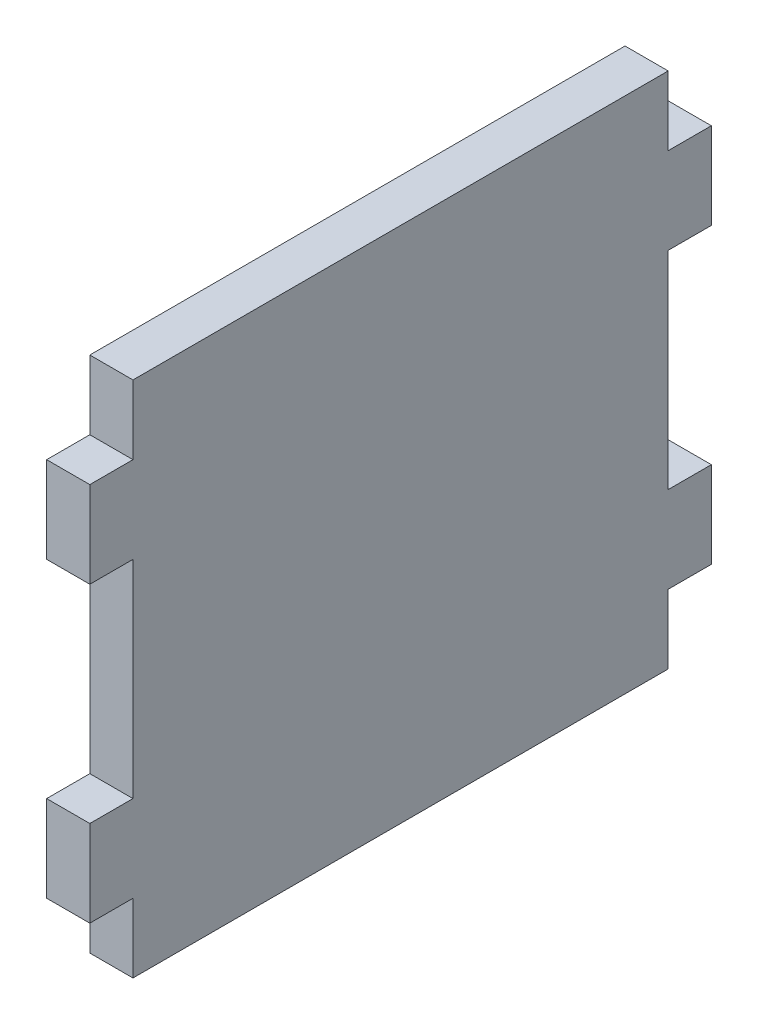
ISO-10303-21;
HEADER;
FILE_DESCRIPTION(('STEP AP214'),'2;1');
FILE_NAME('part.step','',(''),(''),'','','');
FILE_SCHEMA(('AUTOMOTIVE_DESIGN { 1 0 10303 214 1 1 1 1 }'));
ENDSEC;
DATA;
#1=APPLICATION_CONTEXT('core data for automotive mechanical design processes');
#2=APPLICATION_PROTOCOL_DEFINITION('international standard','automotive_design',2000,#1);
#3=PRODUCT_CONTEXT('',#1,'mechanical');
#4=PRODUCT('Part','Part','',(#3));
#5=PRODUCT_RELATED_PRODUCT_CATEGORY('part','',(#4));
#6=PRODUCT_DEFINITION_FORMATION('','',#4);
#7=PRODUCT_DEFINITION_CONTEXT('part definition',#1,'design');
#8=PRODUCT_DEFINITION('design','',#6,#7);
#9=PRODUCT_DEFINITION_SHAPE('','',#8);
#10=(LENGTH_UNIT() NAMED_UNIT(*) SI_UNIT(.MILLI.,.METRE.));
#11=(NAMED_UNIT(*) PLANE_ANGLE_UNIT() SI_UNIT($,.RADIAN.));
#12=(NAMED_UNIT(*) SI_UNIT($,.STERADIAN.) SOLID_ANGLE_UNIT());
#13=UNCERTAINTY_MEASURE_WITH_UNIT(LENGTH_MEASURE(1.E-05),#10,'distance_accuracy_value','');
#14=(GEOMETRIC_REPRESENTATION_CONTEXT(3) GLOBAL_UNCERTAINTY_ASSIGNED_CONTEXT((#13)) GLOBAL_UNIT_ASSIGNED_CONTEXT((#10,
#11,#12)) REPRESENTATION_CONTEXT('',''));
#15=CARTESIAN_POINT('',(0.,0.,0.));
#16=DIRECTION('',(0.,0.,1.));
#17=DIRECTION('',(1.,0.,0.));
#18=AXIS2_PLACEMENT_3D('',#15,#16,#17);
#19=CARTESIAN_POINT('',(5.,22.,28.));
#20=DIRECTION('',(0.,0.,-1.));
#21=DIRECTION('',(0.,1.,0.));
#22=AXIS2_PLACEMENT_3D('',#19,#20,#21);
#23=PLANE('',#22);
#24=DIRECTION('',(0.,-1.,0.));
#25=VECTOR('',#24,1.);
#26=CARTESIAN_POINT('',(0.,22.,28.));
#27=LINE('',#26,#25);
#28=CARTESIAN_POINT('',(0.,30.,28.));
#29=VERTEX_POINT('',#28);
#30=CARTESIAN_POINT('',(0.,22.,28.));
#31=VERTEX_POINT('',#30);
#32=EDGE_CURVE('E208',#29,#31,#27,.T.);
#33=ORIENTED_EDGE('',*,*,#32,.T.);
#34=DIRECTION('',(-1.,0.,0.));
#35=VECTOR('',#34,1.);
#36=CARTESIAN_POINT('',(5.,22.,28.));
#37=LINE('',#36,#35);
#38=CARTESIAN_POINT('',(5.,22.,28.));
#39=VERTEX_POINT('',#38);
#40=EDGE_CURVE('E11',#39,#31,#37,.T.);
#41=ORIENTED_EDGE('',*,*,#40,.F.);
#42=DIRECTION('',(0.,-1.,0.));
#43=VECTOR('',#42,1.);
#44=CARTESIAN_POINT('',(5.,22.,28.));
#45=LINE('',#44,#43);
#46=CARTESIAN_POINT('',(5.,30.,28.));
#47=VERTEX_POINT('',#46);
#48=EDGE_CURVE('E248',#47,#39,#45,.T.);
#49=ORIENTED_EDGE('',*,*,#48,.F.);
#50=DIRECTION('',(-1.,0.,0.));
#51=VECTOR('',#50,1.);
#52=CARTESIAN_POINT('',(5.,30.,28.));
#53=LINE('',#52,#51);
#54=EDGE_CURVE('E204',#47,#29,#53,.T.);
#55=ORIENTED_EDGE('',*,*,#54,.T.);
#56=EDGE_LOOP('',(#33,#41,#49,#55));
#57=FACE_BOUND('',#56,.T.);
#58=ADVANCED_FACE('F39',(#57),#23,.F.);
#59=CARTESIAN_POINT('',(5.,22.,33.));
#60=DIRECTION('',(0.,-1.,0.));
#61=DIRECTION('',(0.,0.,-1.));
#62=AXIS2_PLACEMENT_3D('',#59,#60,#61);
#63=PLANE('',#62);
#64=DIRECTION('',(0.,0.,1.));
#65=VECTOR('',#64,1.);
#66=CARTESIAN_POINT('',(0.,22.,33.));
#67=LINE('',#66,#65);
#68=CARTESIAN_POINT('',(0.,22.,33.));
#69=VERTEX_POINT('',#68);
#70=EDGE_CURVE('E211',#31,#69,#67,.T.);
#71=ORIENTED_EDGE('',*,*,#70,.T.);
#72=DIRECTION('',(-1.,0.,0.));
#73=VECTOR('',#72,1.);
#74=CARTESIAN_POINT('',(5.,22.,33.));
#75=LINE('',#74,#73);
#76=CARTESIAN_POINT('',(5.,22.,33.));
#77=VERTEX_POINT('',#76);
#78=EDGE_CURVE('E47',#77,#69,#75,.T.);
#79=ORIENTED_EDGE('',*,*,#78,.F.);
#80=DIRECTION('',(0.,0.,1.));
#81=VECTOR('',#80,1.);
#82=CARTESIAN_POINT('',(5.,22.,33.));
#83=LINE('',#82,#81);
#84=EDGE_CURVE('E132',#39,#77,#83,.T.);
#85=ORIENTED_EDGE('',*,*,#84,.F.);
#86=ORIENTED_EDGE('',*,*,#40,.T.);
#87=EDGE_LOOP('',(#71,#79,#85,#86));
#88=FACE_BOUND('',#87,.T.);
#89=ADVANCED_FACE('F356',(#88),#63,.F.);
#90=CARTESIAN_POINT('',(5.,12.,33.));
#91=DIRECTION('',(0.,0.,-1.));
#92=DIRECTION('',(-1.,0.,0.));
#93=AXIS2_PLACEMENT_3D('',#90,#91,#92);
#94=PLANE('',#93);
#95=DIRECTION('',(0.,-1.,0.));
#96=VECTOR('',#95,1.);
#97=CARTESIAN_POINT('',(0.,12.,33.));
#98=LINE('',#97,#96);
#99=CARTESIAN_POINT('',(0.,12.,33.));
#100=VERTEX_POINT('',#99);
#101=EDGE_CURVE('E213',#69,#100,#98,.T.);
#102=ORIENTED_EDGE('',*,*,#101,.T.);
#103=DIRECTION('',(-1.,0.,0.));
#104=VECTOR('',#103,1.);
#105=CARTESIAN_POINT('',(5.,12.,33.));
#106=LINE('',#105,#104);
#107=CARTESIAN_POINT('',(5.,12.,33.));
#108=VERTEX_POINT('',#107);
#109=EDGE_CURVE('E291',#108,#100,#106,.T.);
#110=ORIENTED_EDGE('',*,*,#109,.F.);
#111=DIRECTION('',(0.,-1.,0.));
#112=VECTOR('',#111,1.);
#113=CARTESIAN_POINT('',(5.,12.,33.));
#114=LINE('',#113,#112);
#115=EDGE_CURVE('E299',#77,#108,#114,.T.);
#116=ORIENTED_EDGE('',*,*,#115,.F.);
#117=ORIENTED_EDGE('',*,*,#78,.T.);
#118=EDGE_LOOP('',(#102,#110,#116,#117));
#119=FACE_BOUND('',#118,.T.);
#120=ADVANCED_FACE('F297',(#119),#94,.F.);
#121=CARTESIAN_POINT('',(5.,12.,28.));
#122=DIRECTION('',(0.,1.,0.));
#123=DIRECTION('',(0.,0.,1.));
#124=AXIS2_PLACEMENT_3D('',#121,#122,#123);
#125=PLANE('',#124);
#126=DIRECTION('',(0.,0.,-1.));
#127=VECTOR('',#126,1.);
#128=CARTESIAN_POINT('',(0.,12.,28.));
#129=LINE('',#128,#127);
#130=CARTESIAN_POINT('',(0.,12.,28.));
#131=VERTEX_POINT('',#130);
#132=EDGE_CURVE('E215',#100,#131,#129,.T.);
#133=ORIENTED_EDGE('',*,*,#132,.T.);
#134=DIRECTION('',(-1.,0.,0.));
#135=VECTOR('',#134,1.);
#136=CARTESIAN_POINT('',(5.,12.,28.));
#137=LINE('',#136,#135);
#138=CARTESIAN_POINT('',(5.,12.,28.));
#139=VERTEX_POINT('',#138);
#140=EDGE_CURVE('E288',#139,#131,#137,.T.);
#141=ORIENTED_EDGE('',*,*,#140,.F.);
#142=DIRECTION('',(0.,0.,-1.));
#143=VECTOR('',#142,1.);
#144=CARTESIAN_POINT('',(5.,12.,28.));
#145=LINE('',#144,#143);
#146=EDGE_CURVE('E315',#108,#139,#145,.T.);
#147=ORIENTED_EDGE('',*,*,#146,.F.);
#148=ORIENTED_EDGE('',*,*,#109,.T.);
#149=EDGE_LOOP('',(#133,#141,#147,#148));
#150=FACE_BOUND('',#149,.T.);
#151=ADVANCED_FACE('F306',(#150),#125,.F.);
#152=CARTESIAN_POINT('',(5.,-12.,28.));
#153=DIRECTION('',(0.,0.,-1.));
#154=DIRECTION('',(0.,1.,0.));
#155=AXIS2_PLACEMENT_3D('',#152,#153,#154);
#156=PLANE('',#155);
#157=DIRECTION('',(0.,-1.,0.));
#158=VECTOR('',#157,1.);
#159=CARTESIAN_POINT('',(0.,-12.,28.));
#160=LINE('',#159,#158);
#161=CARTESIAN_POINT('',(0.,-12.,28.));
#162=VERTEX_POINT('',#161);
#163=EDGE_CURVE('E217',#131,#162,#160,.T.);
#164=ORIENTED_EDGE('',*,*,#163,.T.);
#165=DIRECTION('',(-1.,0.,0.));
#166=VECTOR('',#165,1.);
#167=CARTESIAN_POINT('',(5.,-12.,28.));
#168=LINE('',#167,#166);
#169=CARTESIAN_POINT('',(5.,-12.,28.));
#170=VERTEX_POINT('',#169);
#171=EDGE_CURVE('E285',#170,#162,#168,.T.);
#172=ORIENTED_EDGE('',*,*,#171,.F.);
#173=DIRECTION('',(0.,-1.,0.));
#174=VECTOR('',#173,1.);
#175=CARTESIAN_POINT('',(5.,-12.,28.));
#176=LINE('',#175,#174);
#177=EDGE_CURVE('E312',#139,#170,#176,.T.);
#178=ORIENTED_EDGE('',*,*,#177,.F.);
#179=ORIENTED_EDGE('',*,*,#140,.T.);
#180=EDGE_LOOP('',(#164,#172,#178,#179));
#181=FACE_BOUND('',#180,.T.);
#182=ADVANCED_FACE('F310',(#181),#156,.F.);
#183=CARTESIAN_POINT('',(5.,-12.,28.));
#184=DIRECTION('',(0.,-1.,0.));
#185=DIRECTION('',(0.,0.,-1.));
#186=AXIS2_PLACEMENT_3D('',#183,#184,#185);
#187=PLANE('',#186);
#188=DIRECTION('',(0.,0.,1.));
#189=VECTOR('',#188,1.);
#190=CARTESIAN_POINT('',(0.,-12.,28.));
#191=LINE('',#190,#189);
#192=CARTESIAN_POINT('',(0.,-12.,33.));
#193=VERTEX_POINT('',#192);
#194=EDGE_CURVE('E219',#162,#193,#191,.T.);
#195=ORIENTED_EDGE('',*,*,#194,.T.);
#196=DIRECTION('',(-1.,0.,0.));
#197=VECTOR('',#196,1.);
#198=CARTESIAN_POINT('',(5.,-12.,33.));
#199=LINE('',#198,#197);
#200=CARTESIAN_POINT('',(5.,-12.,33.));
#201=VERTEX_POINT('',#200);
#202=EDGE_CURVE('E282',#201,#193,#199,.T.);
#203=ORIENTED_EDGE('',*,*,#202,.F.);
#204=DIRECTION('',(0.,0.,1.));
#205=VECTOR('',#204,1.);
#206=CARTESIAN_POINT('',(5.,-12.,28.));
#207=LINE('',#206,#205);
#208=EDGE_CURVE('E314',#170,#201,#207,.T.);
#209=ORIENTED_EDGE('',*,*,#208,.F.);
#210=ORIENTED_EDGE('',*,*,#171,.T.);
#211=EDGE_LOOP('',(#195,#203,#209,#210));
#212=FACE_BOUND('',#211,.T.);
#213=ADVANCED_FACE('F368',(#212),#187,.F.);
#214=CARTESIAN_POINT('',(5.,-12.,33.));
#215=DIRECTION('',(0.,0.,-1.));
#216=DIRECTION('',(-1.,0.,0.));
#217=AXIS2_PLACEMENT_3D('',#214,#215,#216);
#218=PLANE('',#217);
#219=DIRECTION('',(0.,-1.,0.));
#220=VECTOR('',#219,1.);
#221=CARTESIAN_POINT('',(0.,-12.,33.));
#222=LINE('',#221,#220);
#223=CARTESIAN_POINT('',(0.,-22.,33.));
#224=VERTEX_POINT('',#223);
#225=EDGE_CURVE('E221',#193,#224,#222,.T.);
#226=ORIENTED_EDGE('',*,*,#225,.T.);
#227=DIRECTION('',(-1.,0.,0.));
#228=VECTOR('',#227,1.);
#229=CARTESIAN_POINT('',(5.,-22.,33.));
#230=LINE('',#229,#228);
#231=CARTESIAN_POINT('',(5.,-22.,33.));
#232=VERTEX_POINT('',#231);
#233=EDGE_CURVE('E279',#232,#224,#230,.T.);
#234=ORIENTED_EDGE('',*,*,#233,.F.);
#235=DIRECTION('',(0.,-1.,0.));
#236=VECTOR('',#235,1.);
#237=CARTESIAN_POINT('',(5.,-12.,33.));
#238=LINE('',#237,#236);
#239=EDGE_CURVE('E317',#201,#232,#238,.T.);
#240=ORIENTED_EDGE('',*,*,#239,.F.);
#241=ORIENTED_EDGE('',*,*,#202,.T.);
#242=EDGE_LOOP('',(#226,#234,#240,#241));
#243=FACE_BOUND('',#242,.T.);
#244=ADVANCED_FACE('F371',(#243),#218,.F.);
#245=CARTESIAN_POINT('',(5.,-22.,33.));
#246=DIRECTION('',(0.,1.,0.));
#247=DIRECTION('',(0.,0.,1.));
#248=AXIS2_PLACEMENT_3D('',#245,#246,#247);
#249=PLANE('',#248);
#250=DIRECTION('',(0.,0.,-1.));
#251=VECTOR('',#250,1.);
#252=CARTESIAN_POINT('',(0.,-22.,33.));
#253=LINE('',#252,#251);
#254=CARTESIAN_POINT('',(0.,-22.,28.));
#255=VERTEX_POINT('',#254);
#256=EDGE_CURVE('E223',#224,#255,#253,.T.);
#257=ORIENTED_EDGE('',*,*,#256,.T.);
#258=DIRECTION('',(-1.,0.,0.));
#259=VECTOR('',#258,1.);
#260=CARTESIAN_POINT('',(5.,-22.,28.));
#261=LINE('',#260,#259);
#262=CARTESIAN_POINT('',(5.,-22.,28.));
#263=VERTEX_POINT('',#262);
#264=EDGE_CURVE('E276',#263,#255,#261,.T.);
#265=ORIENTED_EDGE('',*,*,#264,.F.);
#266=DIRECTION('',(0.,0.,-1.));
#267=VECTOR('',#266,1.);
#268=CARTESIAN_POINT('',(5.,-22.,33.));
#269=LINE('',#268,#267);
#270=EDGE_CURVE('E323',#232,#263,#269,.T.);
#271=ORIENTED_EDGE('',*,*,#270,.F.);
#272=ORIENTED_EDGE('',*,*,#233,.T.);
#273=EDGE_LOOP('',(#257,#265,#271,#272));
#274=FACE_BOUND('',#273,.T.);
#275=ADVANCED_FACE('F375',(#274),#249,.F.);
#276=CARTESIAN_POINT('',(5.,-30.,28.));
#277=DIRECTION('',(0.,0.,-1.));
#278=DIRECTION('',(0.,1.,0.));
#279=AXIS2_PLACEMENT_3D('',#276,#277,#278);
#280=PLANE('',#279);
#281=DIRECTION('',(0.,-1.,0.));
#282=VECTOR('',#281,1.);
#283=CARTESIAN_POINT('',(0.,-30.,28.));
#284=LINE('',#283,#282);
#285=CARTESIAN_POINT('',(0.,-30.,28.));
#286=VERTEX_POINT('',#285);
#287=EDGE_CURVE('E225',#255,#286,#284,.T.);
#288=ORIENTED_EDGE('',*,*,#287,.T.);
#289=DIRECTION('',(-1.,0.,0.));
#290=VECTOR('',#289,1.);
#291=CARTESIAN_POINT('',(5.,-30.,28.));
#292=LINE('',#291,#290);
#293=CARTESIAN_POINT('',(5.,-30.,28.));
#294=VERTEX_POINT('',#293);
#295=EDGE_CURVE('E273',#294,#286,#292,.T.);
#296=ORIENTED_EDGE('',*,*,#295,.F.);
#297=DIRECTION('',(0.,-1.,0.));
#298=VECTOR('',#297,1.);
#299=CARTESIAN_POINT('',(5.,-30.,28.));
#300=LINE('',#299,#298);
#301=EDGE_CURVE('E325',#263,#294,#300,.T.);
#302=ORIENTED_EDGE('',*,*,#301,.F.);
#303=ORIENTED_EDGE('',*,*,#264,.T.);
#304=EDGE_LOOP('',(#288,#296,#302,#303));
#305=FACE_BOUND('',#304,.T.);
#306=ADVANCED_FACE('F379',(#305),#280,.F.);
#307=CARTESIAN_POINT('',(5.,-30.,-28.));
#308=DIRECTION('',(0.,1.,0.));
#309=DIRECTION('',(0.,0.,1.));
#310=AXIS2_PLACEMENT_3D('',#307,#308,#309);
#311=PLANE('',#310);
#312=DIRECTION('',(0.,0.,-1.));
#313=VECTOR('',#312,1.);
#314=CARTESIAN_POINT('',(0.,-30.,-28.));
#315=LINE('',#314,#313);
#316=CARTESIAN_POINT('',(0.,-30.,-34.));
#317=VERTEX_POINT('',#316);
#318=EDGE_CURVE('E228',#286,#317,#315,.T.);
#319=ORIENTED_EDGE('',*,*,#318,.T.);
#320=DIRECTION('',(-1.,0.,0.));
#321=VECTOR('',#320,1.);
#322=CARTESIAN_POINT('',(5.,-30.,-34.));
#323=LINE('',#322,#321);
#324=CARTESIAN_POINT('',(5.,-30.,-34.));
#325=VERTEX_POINT('',#324);
#326=EDGE_CURVE('E270',#325,#317,#323,.T.);
#327=ORIENTED_EDGE('',*,*,#326,.F.);
#328=DIRECTION('',(0.,0.,-1.));
#329=VECTOR('',#328,1.);
#330=CARTESIAN_POINT('',(5.,-30.,-28.));
#331=LINE('',#330,#329);
#332=EDGE_CURVE('E327',#294,#325,#331,.T.);
#333=ORIENTED_EDGE('',*,*,#332,.F.);
#334=ORIENTED_EDGE('',*,*,#295,.T.);
#335=EDGE_LOOP('',(#319,#327,#333,#334));
#336=FACE_BOUND('',#335,.T.);
#337=ADVANCED_FACE('F383',(#336),#311,.F.);
#338=CARTESIAN_POINT('',(5.,-30.,-34.));
#339=DIRECTION('',(0.,0.,1.));
#340=DIRECTION('',(1.,0.,0.));
#341=AXIS2_PLACEMENT_3D('',#338,#339,#340);
#342=PLANE('',#341);
#343=DIRECTION('',(0.,1.,0.));
#344=VECTOR('',#343,1.);
#345=CARTESIAN_POINT('',(0.,-30.,-34.));
#346=LINE('',#345,#344);
#347=CARTESIAN_POINT('',(0.,-22.,-34.));
#348=VERTEX_POINT('',#347);
#349=EDGE_CURVE('E230',#317,#348,#346,.T.);
#350=ORIENTED_EDGE('',*,*,#349,.T.);
#351=DIRECTION('',(-1.,0.,0.));
#352=VECTOR('',#351,1.);
#353=CARTESIAN_POINT('',(5.,-22.,-34.));
#354=LINE('',#353,#352);
#355=CARTESIAN_POINT('',(5.,-22.,-34.));
#356=VERTEX_POINT('',#355);
#357=EDGE_CURVE('E267',#356,#348,#354,.T.);
#358=ORIENTED_EDGE('',*,*,#357,.F.);
#359=DIRECTION('',(0.,1.,0.));
#360=VECTOR('',#359,1.);
#361=CARTESIAN_POINT('',(5.,-30.,-34.));
#362=LINE('',#361,#360);
#363=EDGE_CURVE('E329',#325,#356,#362,.T.);
#364=ORIENTED_EDGE('',*,*,#363,.F.);
#365=ORIENTED_EDGE('',*,*,#326,.T.);
#366=EDGE_LOOP('',(#350,#358,#364,#365));
#367=FACE_BOUND('',#366,.T.);
#368=ADVANCED_FACE('F387',(#367),#342,.F.);
#369=CARTESIAN_POINT('',(5.,-22.,-34.));
#370=DIRECTION('',(0.,1.,0.));
#371=DIRECTION('',(0.,0.,1.));
#372=AXIS2_PLACEMENT_3D('',#369,#370,#371);
#373=PLANE('',#372);
#374=DIRECTION('',(0.,0.,-1.));
#375=VECTOR('',#374,1.);
#376=CARTESIAN_POINT('',(0.,-22.,-34.));
#377=LINE('',#376,#375);
#378=CARTESIAN_POINT('',(0.,-22.,-39.));
#379=VERTEX_POINT('',#378);
#380=EDGE_CURVE('E232',#348,#379,#377,.T.);
#381=ORIENTED_EDGE('',*,*,#380,.T.);
#382=DIRECTION('',(-1.,0.,0.));
#383=VECTOR('',#382,1.);
#384=CARTESIAN_POINT('',(5.,-22.,-39.));
#385=LINE('',#384,#383);
#386=CARTESIAN_POINT('',(5.,-22.,-39.));
#387=VERTEX_POINT('',#386);
#388=EDGE_CURVE('E264',#387,#379,#385,.T.);
#389=ORIENTED_EDGE('',*,*,#388,.F.);
#390=DIRECTION('',(0.,0.,-1.));
#391=VECTOR('',#390,1.);
#392=CARTESIAN_POINT('',(5.,-22.,-34.));
#393=LINE('',#392,#391);
#394=EDGE_CURVE('E331',#356,#387,#393,.T.);
#395=ORIENTED_EDGE('',*,*,#394,.F.);
#396=ORIENTED_EDGE('',*,*,#357,.T.);
#397=EDGE_LOOP('',(#381,#389,#395,#396));
#398=FACE_BOUND('',#397,.T.);
#399=ADVANCED_FACE('F391',(#398),#373,.F.);
#400=CARTESIAN_POINT('',(5.,-22.,-39.));
#401=DIRECTION('',(0.,0.,1.));
#402=DIRECTION('',(1.,0.,0.));
#403=AXIS2_PLACEMENT_3D('',#400,#401,#402);
#404=PLANE('',#403);
#405=DIRECTION('',(0.,1.,0.));
#406=VECTOR('',#405,1.);
#407=CARTESIAN_POINT('',(0.,-22.,-39.));
#408=LINE('',#407,#406);
#409=CARTESIAN_POINT('',(0.,-12.,-39.));
#410=VERTEX_POINT('',#409);
#411=EDGE_CURVE('E234',#379,#410,#408,.T.);
#412=ORIENTED_EDGE('',*,*,#411,.T.);
#413=DIRECTION('',(-1.,0.,0.));
#414=VECTOR('',#413,1.);
#415=CARTESIAN_POINT('',(5.,-12.,-39.));
#416=LINE('',#415,#414);
#417=CARTESIAN_POINT('',(5.,-12.,-39.));
#418=VERTEX_POINT('',#417);
#419=EDGE_CURVE('E261',#418,#410,#416,.T.);
#420=ORIENTED_EDGE('',*,*,#419,.F.);
#421=DIRECTION('',(0.,1.,0.));
#422=VECTOR('',#421,1.);
#423=CARTESIAN_POINT('',(5.,-22.,-39.));
#424=LINE('',#423,#422);
#425=EDGE_CURVE('E333',#387,#418,#424,.T.);
#426=ORIENTED_EDGE('',*,*,#425,.F.);
#427=ORIENTED_EDGE('',*,*,#388,.T.);
#428=EDGE_LOOP('',(#412,#420,#426,#427));
#429=FACE_BOUND('',#428,.T.);
#430=ADVANCED_FACE('F395',(#429),#404,.F.);
#431=CARTESIAN_POINT('',(5.,-12.,-39.));
#432=DIRECTION('',(0.,-1.,0.));
#433=DIRECTION('',(0.,0.,-1.));
#434=AXIS2_PLACEMENT_3D('',#431,#432,#433);
#435=PLANE('',#434);
#436=DIRECTION('',(0.,0.,1.));
#437=VECTOR('',#436,1.);
#438=CARTESIAN_POINT('',(0.,-12.,-39.));
#439=LINE('',#438,#437);
#440=CARTESIAN_POINT('',(0.,-12.,-34.));
#441=VERTEX_POINT('',#440);
#442=EDGE_CURVE('E236',#410,#441,#439,.T.);
#443=ORIENTED_EDGE('',*,*,#442,.T.);
#444=DIRECTION('',(-1.,0.,0.));
#445=VECTOR('',#444,1.);
#446=CARTESIAN_POINT('',(5.,-12.,-34.));
#447=LINE('',#446,#445);
#448=CARTESIAN_POINT('',(5.,-12.,-34.));
#449=VERTEX_POINT('',#448);
#450=EDGE_CURVE('E258',#449,#441,#447,.T.);
#451=ORIENTED_EDGE('',*,*,#450,.F.);
#452=DIRECTION('',(0.,0.,1.));
#453=VECTOR('',#452,1.);
#454=CARTESIAN_POINT('',(5.,-12.,-39.));
#455=LINE('',#454,#453);
#456=EDGE_CURVE('E335',#418,#449,#455,.T.);
#457=ORIENTED_EDGE('',*,*,#456,.F.);
#458=ORIENTED_EDGE('',*,*,#419,.T.);
#459=EDGE_LOOP('',(#443,#451,#457,#458));
#460=FACE_BOUND('',#459,.T.);
#461=ADVANCED_FACE('F399',(#460),#435,.F.);
#462=CARTESIAN_POINT('',(5.,-12.,-34.));
#463=DIRECTION('',(0.,0.,1.));
#464=DIRECTION('',(1.,0.,0.));
#465=AXIS2_PLACEMENT_3D('',#462,#463,#464);
#466=PLANE('',#465);
#467=DIRECTION('',(0.,1.,0.));
#468=VECTOR('',#467,1.);
#469=CARTESIAN_POINT('',(0.,-12.,-34.));
#470=LINE('',#469,#468);
#471=CARTESIAN_POINT('',(0.,12.,-34.));
#472=VERTEX_POINT('',#471);
#473=EDGE_CURVE('E238',#441,#472,#470,.T.);
#474=ORIENTED_EDGE('',*,*,#473,.T.);
#475=DIRECTION('',(-1.,0.,0.));
#476=VECTOR('',#475,1.);
#477=CARTESIAN_POINT('',(5.,12.,-34.));
#478=LINE('',#477,#476);
#479=CARTESIAN_POINT('',(5.,12.,-34.));
#480=VERTEX_POINT('',#479);
#481=EDGE_CURVE('E255',#480,#472,#478,.T.);
#482=ORIENTED_EDGE('',*,*,#481,.F.);
#483=DIRECTION('',(0.,1.,0.));
#484=VECTOR('',#483,1.);
#485=CARTESIAN_POINT('',(5.,-12.,-34.));
#486=LINE('',#485,#484);
#487=EDGE_CURVE('E337',#449,#480,#486,.T.);
#488=ORIENTED_EDGE('',*,*,#487,.F.);
#489=ORIENTED_EDGE('',*,*,#450,.T.);
#490=EDGE_LOOP('',(#474,#482,#488,#489));
#491=FACE_BOUND('',#490,.T.);
#492=ADVANCED_FACE('F403',(#491),#466,.F.);
#493=CARTESIAN_POINT('',(5.,12.,-34.));
#494=DIRECTION('',(0.,1.,0.));
#495=DIRECTION('',(0.,0.,1.));
#496=AXIS2_PLACEMENT_3D('',#493,#494,#495);
#497=PLANE('',#496);
#498=DIRECTION('',(0.,0.,-1.));
#499=VECTOR('',#498,1.);
#500=CARTESIAN_POINT('',(0.,12.,-34.));
#501=LINE('',#500,#499);
#502=CARTESIAN_POINT('',(0.,12.,-39.));
#503=VERTEX_POINT('',#502);
#504=EDGE_CURVE('E240',#472,#503,#501,.T.);
#505=ORIENTED_EDGE('',*,*,#504,.T.);
#506=DIRECTION('',(-1.,0.,0.));
#507=VECTOR('',#506,1.);
#508=CARTESIAN_POINT('',(5.,12.,-39.));
#509=LINE('',#508,#507);
#510=CARTESIAN_POINT('',(5.,12.,-39.));
#511=VERTEX_POINT('',#510);
#512=EDGE_CURVE('E252',#511,#503,#509,.T.);
#513=ORIENTED_EDGE('',*,*,#512,.F.);
#514=DIRECTION('',(0.,0.,-1.));
#515=VECTOR('',#514,1.);
#516=CARTESIAN_POINT('',(5.,12.,-34.));
#517=LINE('',#516,#515);
#518=EDGE_CURVE('E339',#480,#511,#517,.T.);
#519=ORIENTED_EDGE('',*,*,#518,.F.);
#520=ORIENTED_EDGE('',*,*,#481,.T.);
#521=EDGE_LOOP('',(#505,#513,#519,#520));
#522=FACE_BOUND('',#521,.T.);
#523=ADVANCED_FACE('F345',(#522),#497,.F.);
#524=CARTESIAN_POINT('',(5.,12.,-39.));
#525=DIRECTION('',(0.,0.,1.));
#526=DIRECTION('',(1.,0.,0.));
#527=AXIS2_PLACEMENT_3D('',#524,#525,#526);
#528=PLANE('',#527);
#529=DIRECTION('',(0.,1.,0.));
#530=VECTOR('',#529,1.);
#531=CARTESIAN_POINT('',(0.,12.,-39.));
#532=LINE('',#531,#530);
#533=CARTESIAN_POINT('',(0.,22.,-39.));
#534=VERTEX_POINT('',#533);
#535=EDGE_CURVE('E242',#503,#534,#532,.T.);
#536=ORIENTED_EDGE('',*,*,#535,.T.);
#537=DIRECTION('',(-1.,0.,0.));
#538=VECTOR('',#537,1.);
#539=CARTESIAN_POINT('',(5.,22.,-39.));
#540=LINE('',#539,#538);
#541=CARTESIAN_POINT('',(5.,22.,-39.));
#542=VERTEX_POINT('',#541);
#543=EDGE_CURVE('E199',#542,#534,#540,.T.);
#544=ORIENTED_EDGE('',*,*,#543,.F.);
#545=DIRECTION('',(0.,1.,0.));
#546=VECTOR('',#545,1.);
#547=CARTESIAN_POINT('',(5.,12.,-39.));
#548=LINE('',#547,#546);
#549=EDGE_CURVE('E188',#511,#542,#548,.T.);
#550=ORIENTED_EDGE('',*,*,#549,.F.);
#551=ORIENTED_EDGE('',*,*,#512,.T.);
#552=EDGE_LOOP('',(#536,#544,#550,#551));
#553=FACE_BOUND('',#552,.T.);
#554=ADVANCED_FACE('F349',(#553),#528,.F.);
#555=CARTESIAN_POINT('',(5.,22.,-39.));
#556=DIRECTION('',(0.,-1.,0.));
#557=DIRECTION('',(0.,0.,-1.));
#558=AXIS2_PLACEMENT_3D('',#555,#556,#557);
#559=PLANE('',#558);
#560=DIRECTION('',(0.,0.,1.));
#561=VECTOR('',#560,1.);
#562=CARTESIAN_POINT('',(0.,22.,-39.));
#563=LINE('',#562,#561);
#564=CARTESIAN_POINT('',(0.,22.,-34.));
#565=VERTEX_POINT('',#564);
#566=EDGE_CURVE('E197',#534,#565,#563,.T.);
#567=ORIENTED_EDGE('',*,*,#566,.T.);
#568=DIRECTION('',(-1.,0.,0.));
#569=VECTOR('',#568,1.);
#570=CARTESIAN_POINT('',(5.,22.,-34.));
#571=LINE('',#570,#569);
#572=CARTESIAN_POINT('',(5.,22.,-34.));
#573=VERTEX_POINT('',#572);
#574=EDGE_CURVE('E194',#573,#565,#571,.T.);
#575=ORIENTED_EDGE('',*,*,#574,.F.);
#576=DIRECTION('',(0.,0.,1.));
#577=VECTOR('',#576,1.);
#578=CARTESIAN_POINT('',(5.,22.,-39.));
#579=LINE('',#578,#577);
#580=EDGE_CURVE('E181',#542,#573,#579,.T.);
#581=ORIENTED_EDGE('',*,*,#580,.F.);
#582=ORIENTED_EDGE('',*,*,#543,.T.);
#583=EDGE_LOOP('',(#567,#575,#581,#582));
#584=FACE_BOUND('',#583,.T.);
#585=ADVANCED_FACE('F195',(#584),#559,.F.);
#586=CARTESIAN_POINT('',(5.,22.,-34.));
#587=DIRECTION('',(0.,0.,1.));
#588=DIRECTION('',(1.,0.,0.));
#589=AXIS2_PLACEMENT_3D('',#586,#587,#588);
#590=PLANE('',#589);
#591=DIRECTION('',(0.,1.,0.));
#592=VECTOR('',#591,1.);
#593=CARTESIAN_POINT('',(0.,22.,-34.));
#594=LINE('',#593,#592);
#595=CARTESIAN_POINT('',(0.,30.,-34.));
#596=VERTEX_POINT('',#595);
#597=EDGE_CURVE('E245',#565,#596,#594,.T.);
#598=ORIENTED_EDGE('',*,*,#597,.T.);
#599=DIRECTION('',(-1.,0.,0.));
#600=VECTOR('',#599,1.);
#601=CARTESIAN_POINT('',(5.,30.,-34.));
#602=LINE('',#601,#600);
#603=CARTESIAN_POINT('',(5.,30.,-34.));
#604=VERTEX_POINT('',#603);
#605=EDGE_CURVE('E200',#604,#596,#602,.T.);
#606=ORIENTED_EDGE('',*,*,#605,.F.);
#607=DIRECTION('',(0.,1.,0.));
#608=VECTOR('',#607,1.);
#609=CARTESIAN_POINT('',(5.,22.,-34.));
#610=LINE('',#609,#608);
#611=EDGE_CURVE('E185',#573,#604,#610,.T.);
#612=ORIENTED_EDGE('',*,*,#611,.F.);
#613=ORIENTED_EDGE('',*,*,#574,.T.);
#614=EDGE_LOOP('',(#598,#606,#612,#613));
#615=FACE_BOUND('',#614,.T.);
#616=ADVANCED_FACE('F202',(#615),#590,.F.);
#617=CARTESIAN_POINT('',(5.,30.,-28.));
#618=DIRECTION('',(0.,-1.,0.));
#619=DIRECTION('',(0.,0.,-1.));
#620=AXIS2_PLACEMENT_3D('',#617,#618,#619);
#621=PLANE('',#620);
#622=DIRECTION('',(0.,0.,1.));
#623=VECTOR('',#622,1.);
#624=CARTESIAN_POINT('',(0.,30.,-28.));
#625=LINE('',#624,#623);
#626=EDGE_CURVE('E120',#596,#29,#625,.T.);
#627=ORIENTED_EDGE('',*,*,#626,.T.);
#628=ORIENTED_EDGE('',*,*,#54,.F.);
#629=DIRECTION('',(0.,0.,1.));
#630=VECTOR('',#629,1.);
#631=CARTESIAN_POINT('',(5.,30.,-34.));
#632=LINE('',#631,#630);
#633=EDGE_CURVE('E55',#604,#47,#632,.T.);
#634=ORIENTED_EDGE('',*,*,#633,.F.);
#635=ORIENTED_EDGE('',*,*,#605,.T.);
#636=EDGE_LOOP('',(#627,#628,#634,#635));
#637=FACE_BOUND('',#636,.T.);
#638=ADVANCED_FACE('F350',(#637),#621,.F.);
#639=CARTESIAN_POINT('',(5.,0.,0.));
#640=DIRECTION('',(1.,0.,0.));
#641=DIRECTION('',(0.,0.,-1.));
#642=AXIS2_PLACEMENT_3D('',#639,#640,#641);
#643=PLANE('',#642);
#644=ORIENTED_EDGE('',*,*,#48,.T.);
#645=ORIENTED_EDGE('',*,*,#84,.T.);
#646=ORIENTED_EDGE('',*,*,#115,.T.);
#647=ORIENTED_EDGE('',*,*,#146,.T.);
#648=ORIENTED_EDGE('',*,*,#177,.T.);
#649=ORIENTED_EDGE('',*,*,#208,.T.);
#650=ORIENTED_EDGE('',*,*,#239,.T.);
#651=ORIENTED_EDGE('',*,*,#270,.T.);
#652=ORIENTED_EDGE('',*,*,#301,.T.);
#653=ORIENTED_EDGE('',*,*,#332,.T.);
#654=ORIENTED_EDGE('',*,*,#363,.T.);
#655=ORIENTED_EDGE('',*,*,#394,.T.);
#656=ORIENTED_EDGE('',*,*,#425,.T.);
#657=ORIENTED_EDGE('',*,*,#456,.T.);
#658=ORIENTED_EDGE('',*,*,#487,.T.);
#659=ORIENTED_EDGE('',*,*,#518,.T.);
#660=ORIENTED_EDGE('',*,*,#549,.T.);
#661=ORIENTED_EDGE('',*,*,#580,.T.);
#662=ORIENTED_EDGE('',*,*,#611,.T.);
#663=ORIENTED_EDGE('',*,*,#633,.T.);
#664=EDGE_LOOP('',(#644,#645,#646,#647,#648,#649,#650,#651,#652,#653,#654,#655,#656,#657,#658,
#659,#660,#661,#662,#663));
#665=FACE_BOUND('',#664,.T.);
#666=ADVANCED_FACE('F183',(#665),#643,.T.);
#667=CARTESIAN_POINT('',(0.,0.,0.));
#668=DIRECTION('',(1.,0.,0.));
#669=DIRECTION('',(0.,0.,-1.));
#670=AXIS2_PLACEMENT_3D('',#667,#668,#669);
#671=PLANE('',#670);
#672=ORIENTED_EDGE('',*,*,#32,.F.);
#673=ORIENTED_EDGE('',*,*,#626,.F.);
#674=ORIENTED_EDGE('',*,*,#597,.F.);
#675=ORIENTED_EDGE('',*,*,#566,.F.);
#676=ORIENTED_EDGE('',*,*,#535,.F.);
#677=ORIENTED_EDGE('',*,*,#504,.F.);
#678=ORIENTED_EDGE('',*,*,#473,.F.);
#679=ORIENTED_EDGE('',*,*,#442,.F.);
#680=ORIENTED_EDGE('',*,*,#411,.F.);
#681=ORIENTED_EDGE('',*,*,#380,.F.);
#682=ORIENTED_EDGE('',*,*,#349,.F.);
#683=ORIENTED_EDGE('',*,*,#318,.F.);
#684=ORIENTED_EDGE('',*,*,#287,.F.);
#685=ORIENTED_EDGE('',*,*,#256,.F.);
#686=ORIENTED_EDGE('',*,*,#225,.F.);
#687=ORIENTED_EDGE('',*,*,#194,.F.);
#688=ORIENTED_EDGE('',*,*,#163,.F.);
#689=ORIENTED_EDGE('',*,*,#132,.F.);
#690=ORIENTED_EDGE('',*,*,#101,.F.);
#691=ORIENTED_EDGE('',*,*,#70,.F.);
#692=EDGE_LOOP('',(#672,#673,#674,#675,#676,#677,#678,#679,#680,#681,#682,#683,#684,#685,#686,
#687,#688,#689,#690,#691));
#693=FACE_BOUND('',#692,.T.);
#694=ADVANCED_FACE('F301',(#693),#671,.F.);
#695=CLOSED_SHELL('',(#58,#89,#120,#151,#182,#213,#244,#275,#306,#337,#368,#399,#430,#461,#492,
#523,#554,#585,#616,#638,#666,#694));
#696=MANIFOLD_SOLID_BREP('B2',#695);
#697=ADVANCED_BREP_SHAPE_REPRESENTATION('',(#18,#696),#14);
#698=SHAPE_DEFINITION_REPRESENTATION(#9,#697);
ENDSEC;
END-ISO-10303-21;
